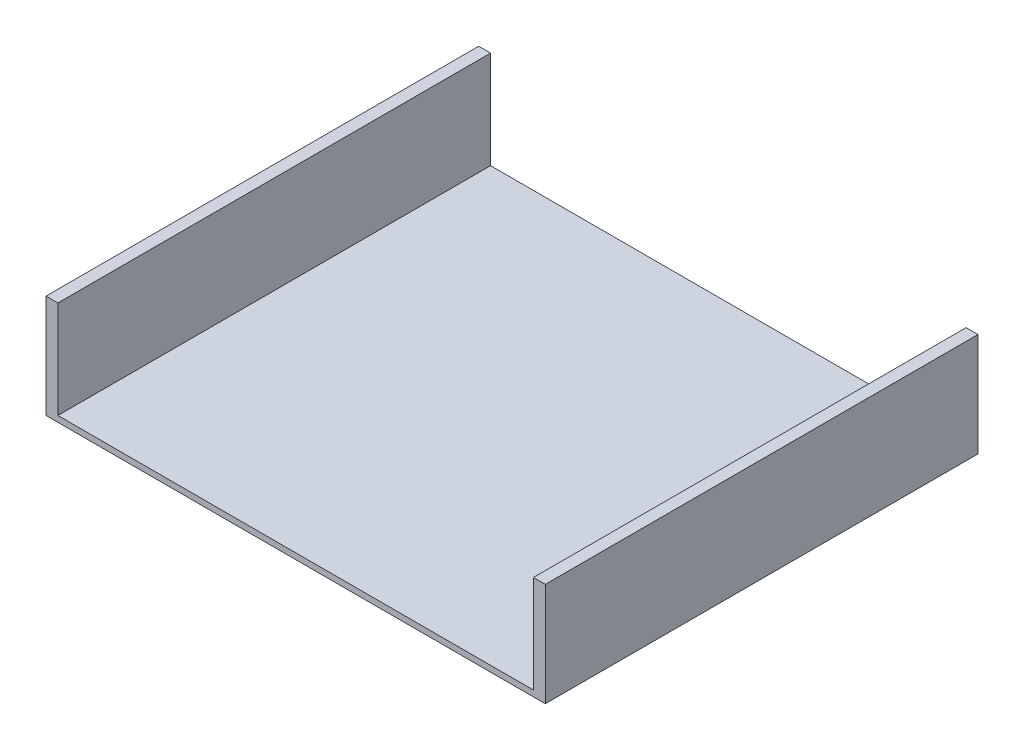
ISO-10303-21;
HEADER;
FILE_DESCRIPTION(('STEP AP214'),'2;1');
FILE_NAME('part.step','',(''),(''),'','','');
FILE_SCHEMA(('AUTOMOTIVE_DESIGN { 1 0 10303 214 1 1 1 1 }'));
ENDSEC;
DATA;
#1=APPLICATION_CONTEXT('core data for automotive mechanical design processes');
#2=APPLICATION_PROTOCOL_DEFINITION('international standard','automotive_design',2000,#1);
#3=PRODUCT_CONTEXT('',#1,'mechanical');
#4=PRODUCT('Part','Part','',(#3));
#5=PRODUCT_RELATED_PRODUCT_CATEGORY('part','',(#4));
#6=PRODUCT_DEFINITION_FORMATION('','',#4);
#7=PRODUCT_DEFINITION_CONTEXT('part definition',#1,'design');
#8=PRODUCT_DEFINITION('design','',#6,#7);
#9=PRODUCT_DEFINITION_SHAPE('','',#8);
#10=(LENGTH_UNIT() NAMED_UNIT(*) SI_UNIT(.MILLI.,.METRE.));
#11=(NAMED_UNIT(*) PLANE_ANGLE_UNIT() SI_UNIT($,.RADIAN.));
#12=(NAMED_UNIT(*) SI_UNIT($,.STERADIAN.) SOLID_ANGLE_UNIT());
#13=UNCERTAINTY_MEASURE_WITH_UNIT(LENGTH_MEASURE(1.E-05),#10,'distance_accuracy_value','');
#14=(GEOMETRIC_REPRESENTATION_CONTEXT(3) GLOBAL_UNCERTAINTY_ASSIGNED_CONTEXT((#13)) GLOBAL_UNIT_ASSIGNED_CONTEXT((#10,
#11,#12)) REPRESENTATION_CONTEXT('',''));
#15=CARTESIAN_POINT('',(0.,0.,0.));
#16=DIRECTION('',(0.,0.,1.));
#17=DIRECTION('',(1.,0.,0.));
#18=AXIS2_PLACEMENT_3D('',#15,#16,#17);
#19=CARTESIAN_POINT('',(105.,0.,182.));
#20=DIRECTION('',(-1.,0.,0.));
#21=DIRECTION('',(0.,0.,1.));
#22=AXIS2_PLACEMENT_3D('',#19,#20,#21);
#23=PLANE('',#22);
#24=DIRECTION('',(0.,1.,0.));
#25=VECTOR('',#24,1.);
#26=CARTESIAN_POINT('',(105.,0.,0.));
#27=LINE('',#26,#25);
#28=CARTESIAN_POINT('',(105.,-23.,0.));
#29=VERTEX_POINT('',#28);
#30=CARTESIAN_POINT('',(105.,20.5,0.));
#31=VERTEX_POINT('',#30);
#32=EDGE_CURVE('E129',#29,#31,#27,.T.);
#33=ORIENTED_EDGE('',*,*,#32,.T.);
#34=DIRECTION('',(0.,0.,-1.));
#35=VECTOR('',#34,1.);
#36=CARTESIAN_POINT('',(105.,20.5,182.));
#37=LINE('',#36,#35);
#38=CARTESIAN_POINT('',(105.,20.5,182.));
#39=VERTEX_POINT('',#38);
#40=EDGE_CURVE('E11',#39,#31,#37,.T.);
#41=ORIENTED_EDGE('',*,*,#40,.F.);
#42=DIRECTION('',(0.,1.,0.));
#43=VECTOR('',#42,1.);
#44=CARTESIAN_POINT('',(105.,0.,182.));
#45=LINE('',#44,#43);
#46=CARTESIAN_POINT('',(105.,-23.,182.));
#47=VERTEX_POINT('',#46);
#48=EDGE_CURVE('E147',#47,#39,#45,.T.);
#49=ORIENTED_EDGE('',*,*,#48,.F.);
#50=DIRECTION('',(0.,0.,-1.));
#51=VECTOR('',#50,1.);
#52=CARTESIAN_POINT('',(105.,-23.,182.));
#53=LINE('',#52,#51);
#54=EDGE_CURVE('E125',#47,#29,#53,.T.);
#55=ORIENTED_EDGE('',*,*,#54,.T.);
#56=EDGE_LOOP('',(#33,#41,#49,#55));
#57=FACE_BOUND('',#56,.T.);
#58=ADVANCED_FACE('F33',(#57),#23,.F.);
#59=CARTESIAN_POINT('',(0.,20.5000000000001,182.));
#60=DIRECTION('',(0.,-1.,0.));
#61=DIRECTION('',(1.,0.,0.));
#62=AXIS2_PLACEMENT_3D('',#59,#60,#61);
#63=PLANE('',#62);
#64=DIRECTION('',(-1.,0.,0.));
#65=VECTOR('',#64,1.);
#66=CARTESIAN_POINT('',(0.,20.5000000000001,0.));
#67=LINE('',#66,#65);
#68=CARTESIAN_POINT('',(100.,20.5,0.));
#69=VERTEX_POINT('',#68);
#70=EDGE_CURVE('E132',#31,#69,#67,.T.);
#71=ORIENTED_EDGE('',*,*,#70,.T.);
#72=DIRECTION('',(0.,0.,-1.));
#73=VECTOR('',#72,1.);
#74=CARTESIAN_POINT('',(100.,20.5,182.));
#75=LINE('',#74,#73);
#76=CARTESIAN_POINT('',(100.,20.5,182.));
#77=VERTEX_POINT('',#76);
#78=EDGE_CURVE('E41',#77,#69,#75,.T.);
#79=ORIENTED_EDGE('',*,*,#78,.F.);
#80=DIRECTION('',(-1.,0.,0.));
#81=VECTOR('',#80,1.);
#82=CARTESIAN_POINT('',(0.,20.5000000000001,182.));
#83=LINE('',#82,#81);
#84=EDGE_CURVE('E88',#39,#77,#83,.T.);
#85=ORIENTED_EDGE('',*,*,#84,.F.);
#86=ORIENTED_EDGE('',*,*,#40,.T.);
#87=EDGE_LOOP('',(#71,#79,#85,#86));
#88=FACE_BOUND('',#87,.T.);
#89=ADVANCED_FACE('F160',(#88),#63,.F.);
#90=CARTESIAN_POINT('',(100.,0.,182.));
#91=DIRECTION('',(-1.,0.,0.));
#92=DIRECTION('',(0.,0.,1.));
#93=AXIS2_PLACEMENT_3D('',#90,#91,#92);
#94=PLANE('',#93);
#95=DIRECTION('',(0.,1.,0.));
#96=VECTOR('',#95,1.);
#97=CARTESIAN_POINT('',(100.,0.,0.));
#98=LINE('',#97,#96);
#99=CARTESIAN_POINT('',(100.,-20.5,0.));
#100=VERTEX_POINT('',#99);
#101=EDGE_CURVE('E135',#100,#69,#98,.T.);
#102=ORIENTED_EDGE('',*,*,#101,.F.);
#103=DIRECTION('',(0.,0.,-1.));
#104=VECTOR('',#103,1.);
#105=CARTESIAN_POINT('',(100.,-20.5,182.));
#106=LINE('',#105,#104);
#107=CARTESIAN_POINT('',(100.,-20.5,182.));
#108=VERTEX_POINT('',#107);
#109=EDGE_CURVE('E153',#108,#100,#106,.T.);
#110=ORIENTED_EDGE('',*,*,#109,.F.);
#111=DIRECTION('',(0.,1.,0.));
#112=VECTOR('',#111,1.);
#113=CARTESIAN_POINT('',(100.,0.,182.));
#114=LINE('',#113,#112);
#115=EDGE_CURVE('E159',#108,#77,#114,.T.);
#116=ORIENTED_EDGE('',*,*,#115,.T.);
#117=ORIENTED_EDGE('',*,*,#78,.T.);
#118=EDGE_LOOP('',(#102,#110,#116,#117));
#119=FACE_BOUND('',#118,.T.);
#120=ADVANCED_FACE('F157',(#119),#94,.T.);
#121=CARTESIAN_POINT('',(0.,-20.5,182.));
#122=DIRECTION('',(0.,1.,0.));
#123=DIRECTION('',(0.,0.,1.));
#124=AXIS2_PLACEMENT_3D('',#121,#122,#123);
#125=PLANE('',#124);
#126=DIRECTION('',(1.,0.,0.));
#127=VECTOR('',#126,1.);
#128=CARTESIAN_POINT('',(0.,-20.5,0.));
#129=LINE('',#128,#127);
#130=CARTESIAN_POINT('',(-100.,-20.5,0.));
#131=VERTEX_POINT('',#130);
#132=EDGE_CURVE('E138',#131,#100,#129,.T.);
#133=ORIENTED_EDGE('',*,*,#132,.F.);
#134=DIRECTION('',(0.,0.,-1.));
#135=VECTOR('',#134,1.);
#136=CARTESIAN_POINT('',(-100.,-20.5,182.));
#137=LINE('',#136,#135);
#138=CARTESIAN_POINT('',(-100.,-20.5,182.));
#139=VERTEX_POINT('',#138);
#140=EDGE_CURVE('E151',#139,#131,#137,.T.);
#141=ORIENTED_EDGE('',*,*,#140,.F.);
#142=DIRECTION('',(1.,0.,0.));
#143=VECTOR('',#142,1.);
#144=CARTESIAN_POINT('',(0.,-20.5,182.));
#145=LINE('',#144,#143);
#146=EDGE_CURVE('E170',#139,#108,#145,.T.);
#147=ORIENTED_EDGE('',*,*,#146,.T.);
#148=ORIENTED_EDGE('',*,*,#109,.T.);
#149=EDGE_LOOP('',(#133,#141,#147,#148));
#150=FACE_BOUND('',#149,.T.);
#151=ADVANCED_FACE('F168',(#150),#125,.T.);
#152=CARTESIAN_POINT('',(-100.,0.,182.));
#153=DIRECTION('',(-1.,0.,0.));
#154=DIRECTION('',(0.,0.,1.));
#155=AXIS2_PLACEMENT_3D('',#152,#153,#154);
#156=PLANE('',#155);
#157=DIRECTION('',(0.,1.,0.));
#158=VECTOR('',#157,1.);
#159=CARTESIAN_POINT('',(-100.,0.,0.));
#160=LINE('',#159,#158);
#161=CARTESIAN_POINT('',(-100.,20.5,0.));
#162=VERTEX_POINT('',#161);
#163=EDGE_CURVE('E141',#131,#162,#160,.T.);
#164=ORIENTED_EDGE('',*,*,#163,.T.);
#165=DIRECTION('',(0.,0.,-1.));
#166=VECTOR('',#165,1.);
#167=CARTESIAN_POINT('',(-100.,20.5,182.));
#168=LINE('',#167,#166);
#169=CARTESIAN_POINT('',(-100.,20.5,182.));
#170=VERTEX_POINT('',#169);
#171=EDGE_CURVE('E121',#170,#162,#168,.T.);
#172=ORIENTED_EDGE('',*,*,#171,.F.);
#173=DIRECTION('',(0.,1.,0.));
#174=VECTOR('',#173,1.);
#175=CARTESIAN_POINT('',(-100.,0.,182.));
#176=LINE('',#175,#174);
#177=EDGE_CURVE('E108',#139,#170,#176,.T.);
#178=ORIENTED_EDGE('',*,*,#177,.F.);
#179=ORIENTED_EDGE('',*,*,#140,.T.);
#180=EDGE_LOOP('',(#164,#172,#178,#179));
#181=FACE_BOUND('',#180,.T.);
#182=ADVANCED_FACE('F198',(#181),#156,.F.);
#183=CARTESIAN_POINT('',(0.,20.5000000000001,182.));
#184=DIRECTION('',(0.,-1.,0.));
#185=DIRECTION('',(1.,0.,0.));
#186=AXIS2_PLACEMENT_3D('',#183,#184,#185);
#187=PLANE('',#186);
#188=DIRECTION('',(-1.,0.,0.));
#189=VECTOR('',#188,1.);
#190=CARTESIAN_POINT('',(0.,20.5000000000001,0.));
#191=LINE('',#190,#189);
#192=CARTESIAN_POINT('',(-105.,20.5,0.));
#193=VERTEX_POINT('',#192);
#194=EDGE_CURVE('E117',#162,#193,#191,.T.);
#195=ORIENTED_EDGE('',*,*,#194,.T.);
#196=DIRECTION('',(0.,0.,-1.));
#197=VECTOR('',#196,1.);
#198=CARTESIAN_POINT('',(-105.,20.5,182.));
#199=LINE('',#198,#197);
#200=CARTESIAN_POINT('',(-105.,20.5,182.));
#201=VERTEX_POINT('',#200);
#202=EDGE_CURVE('E114',#201,#193,#199,.T.);
#203=ORIENTED_EDGE('',*,*,#202,.F.);
#204=DIRECTION('',(-1.,0.,0.));
#205=VECTOR('',#204,1.);
#206=CARTESIAN_POINT('',(0.,20.5000000000001,182.));
#207=LINE('',#206,#205);
#208=EDGE_CURVE('E101',#170,#201,#207,.T.);
#209=ORIENTED_EDGE('',*,*,#208,.F.);
#210=ORIENTED_EDGE('',*,*,#171,.T.);
#211=EDGE_LOOP('',(#195,#203,#209,#210));
#212=FACE_BOUND('',#211,.T.);
#213=ADVANCED_FACE('F115',(#212),#187,.F.);
#214=CARTESIAN_POINT('',(-105.,0.,182.));
#215=DIRECTION('',(-1.,0.,0.));
#216=DIRECTION('',(0.,0.,1.));
#217=AXIS2_PLACEMENT_3D('',#214,#215,#216);
#218=PLANE('',#217);
#219=DIRECTION('',(0.,1.,0.));
#220=VECTOR('',#219,1.);
#221=CARTESIAN_POINT('',(-105.,0.,0.));
#222=LINE('',#221,#220);
#223=CARTESIAN_POINT('',(-105.,-23.,0.));
#224=VERTEX_POINT('',#223);
#225=EDGE_CURVE('E144',#224,#193,#222,.T.);
#226=ORIENTED_EDGE('',*,*,#225,.F.);
#227=DIRECTION('',(0.,0.,-1.));
#228=VECTOR('',#227,1.);
#229=CARTESIAN_POINT('',(-105.,-23.,182.));
#230=LINE('',#229,#228);
#231=CARTESIAN_POINT('',(-105.,-23.,182.));
#232=VERTEX_POINT('',#231);
#233=EDGE_CURVE('E77',#232,#224,#230,.T.);
#234=ORIENTED_EDGE('',*,*,#233,.F.);
#235=DIRECTION('',(0.,1.,0.));
#236=VECTOR('',#235,1.);
#237=CARTESIAN_POINT('',(-105.,0.,182.));
#238=LINE('',#237,#236);
#239=EDGE_CURVE('E105',#232,#201,#238,.T.);
#240=ORIENTED_EDGE('',*,*,#239,.T.);
#241=ORIENTED_EDGE('',*,*,#202,.T.);
#242=EDGE_LOOP('',(#226,#234,#240,#241));
#243=FACE_BOUND('',#242,.T.);
#244=ADVANCED_FACE('F123',(#243),#218,.T.);
#245=CARTESIAN_POINT('',(0.,-23.,182.));
#246=DIRECTION('',(0.,1.,0.));
#247=DIRECTION('',(0.,0.,1.));
#248=AXIS2_PLACEMENT_3D('',#245,#246,#247);
#249=PLANE('',#248);
#250=DIRECTION('',(1.,0.,0.));
#251=VECTOR('',#250,1.);
#252=CARTESIAN_POINT('',(0.,-23.,0.));
#253=LINE('',#252,#251);
#254=EDGE_CURVE('E80',#224,#29,#253,.T.);
#255=ORIENTED_EDGE('',*,*,#254,.T.);
#256=ORIENTED_EDGE('',*,*,#54,.F.);
#257=DIRECTION('',(1.,0.,0.));
#258=VECTOR('',#257,1.);
#259=CARTESIAN_POINT('',(0.,-23.,182.));
#260=LINE('',#259,#258);
#261=EDGE_CURVE('E49',#232,#47,#260,.T.);
#262=ORIENTED_EDGE('',*,*,#261,.F.);
#263=ORIENTED_EDGE('',*,*,#233,.T.);
#264=EDGE_LOOP('',(#255,#256,#262,#263));
#265=FACE_BOUND('',#264,.T.);
#266=ADVANCED_FACE('F177',(#265),#249,.F.);
#267=CARTESIAN_POINT('',(0.,0.,182.));
#268=DIRECTION('',(0.,0.,1.));
#269=DIRECTION('',(1.,0.,0.));
#270=AXIS2_PLACEMENT_3D('',#267,#268,#269);
#271=PLANE('',#270);
#272=ORIENTED_EDGE('',*,*,#48,.T.);
#273=ORIENTED_EDGE('',*,*,#84,.T.);
#274=ORIENTED_EDGE('',*,*,#115,.F.);
#275=ORIENTED_EDGE('',*,*,#146,.F.);
#276=ORIENTED_EDGE('',*,*,#177,.T.);
#277=ORIENTED_EDGE('',*,*,#208,.T.);
#278=ORIENTED_EDGE('',*,*,#239,.F.);
#279=ORIENTED_EDGE('',*,*,#261,.T.);
#280=EDGE_LOOP('',(#272,#273,#274,#275,#276,#277,#278,#279));
#281=FACE_BOUND('',#280,.T.);
#282=ADVANCED_FACE('F103',(#281),#271,.T.);
#283=CARTESIAN_POINT('',(0.,0.,0.));
#284=DIRECTION('',(0.,0.,1.));
#285=DIRECTION('',(1.,0.,0.));
#286=AXIS2_PLACEMENT_3D('',#283,#284,#285);
#287=PLANE('',#286);
#288=ORIENTED_EDGE('',*,*,#32,.F.);
#289=ORIENTED_EDGE('',*,*,#254,.F.);
#290=ORIENTED_EDGE('',*,*,#225,.T.);
#291=ORIENTED_EDGE('',*,*,#194,.F.);
#292=ORIENTED_EDGE('',*,*,#163,.F.);
#293=ORIENTED_EDGE('',*,*,#132,.T.);
#294=ORIENTED_EDGE('',*,*,#101,.T.);
#295=ORIENTED_EDGE('',*,*,#70,.F.);
#296=EDGE_LOOP('',(#288,#289,#290,#291,#292,#293,#294,#295));
#297=FACE_BOUND('',#296,.T.);
#298=ADVANCED_FACE('F164',(#297),#287,.F.);
#299=CLOSED_SHELL('',(#58,#89,#120,#151,#182,#213,#244,#266,#282,#298));
#300=MANIFOLD_SOLID_BREP('B2',#299);
#301=ADVANCED_BREP_SHAPE_REPRESENTATION('',(#18,#300),#14);
#302=SHAPE_DEFINITION_REPRESENTATION(#9,#301);
ENDSEC;
END-ISO-10303-21;
